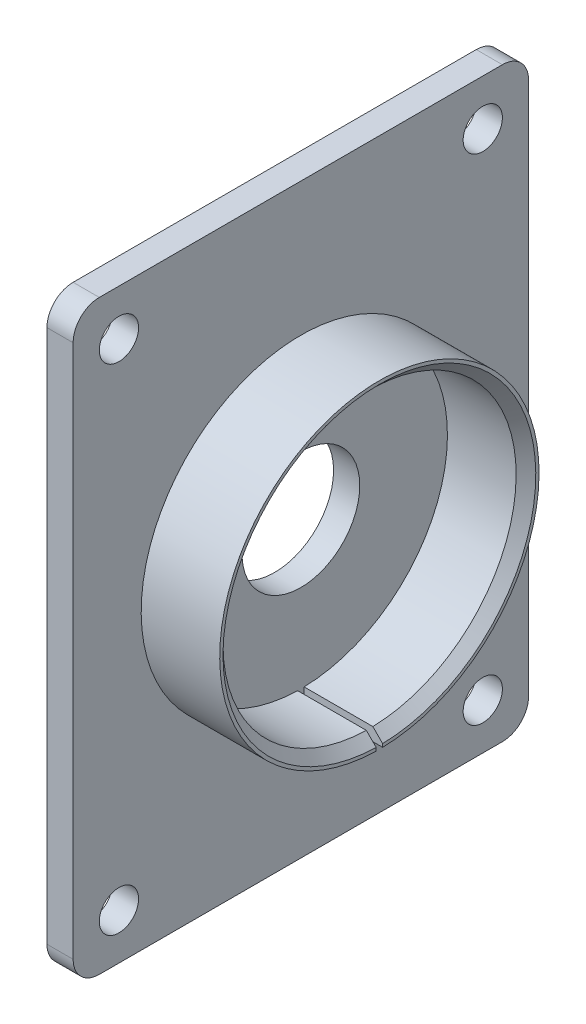
ISO-10303-21;
HEADER;
FILE_DESCRIPTION(('STEP AP214'),'2;1');
FILE_NAME('part.step','',(''),(''),'','','');
FILE_SCHEMA(('AUTOMOTIVE_DESIGN { 1 0 10303 214 1 1 1 1 }'));
ENDSEC;
DATA;
#1=APPLICATION_CONTEXT('core data for automotive mechanical design processes');
#2=APPLICATION_PROTOCOL_DEFINITION('international standard','automotive_design',2000,#1);
#3=PRODUCT_CONTEXT('',#1,'mechanical');
#4=PRODUCT('Part','Part','',(#3));
#5=PRODUCT_RELATED_PRODUCT_CATEGORY('part','',(#4));
#6=PRODUCT_DEFINITION_FORMATION('','',#4);
#7=PRODUCT_DEFINITION_CONTEXT('part definition',#1,'design');
#8=PRODUCT_DEFINITION('design','',#6,#7);
#9=PRODUCT_DEFINITION_SHAPE('','',#8);
#10=(LENGTH_UNIT() NAMED_UNIT(*) SI_UNIT(.MILLI.,.METRE.));
#11=(NAMED_UNIT(*) PLANE_ANGLE_UNIT() SI_UNIT($,.RADIAN.));
#12=(NAMED_UNIT(*) SI_UNIT($,.STERADIAN.) SOLID_ANGLE_UNIT());
#13=UNCERTAINTY_MEASURE_WITH_UNIT(LENGTH_MEASURE(1.E-05),#10,'distance_accuracy_value','');
#14=(GEOMETRIC_REPRESENTATION_CONTEXT(3) GLOBAL_UNCERTAINTY_ASSIGNED_CONTEXT((#13)) GLOBAL_UNIT_ASSIGNED_CONTEXT((#10,
#11,#12)) REPRESENTATION_CONTEXT('',''));
#15=CARTESIAN_POINT('',(0.,0.,0.));
#16=DIRECTION('',(0.,0.,1.));
#17=DIRECTION('',(1.,0.,0.));
#18=AXIS2_PLACEMENT_3D('',#15,#16,#17);
#19=CARTESIAN_POINT('',(6.,0.,0.));
#20=DIRECTION('',(-1.,0.,0.));
#21=DIRECTION('',(0.,0.,1.));
#22=AXIS2_PLACEMENT_3D('',#19,#20,#21);
#23=CYLINDRICAL_SURFACE('',#22,12.2);
#24=CARTESIAN_POINT('',(0.,0.,0.));
#25=DIRECTION('',(1.,0.,0.));
#26=DIRECTION('',(0.,0.,-1.));
#27=AXIS2_PLACEMENT_3D('',#24,#25,#26);
#28=CIRCLE('',#27,12.2);
#29=CARTESIAN_POINT('',(0.,-12.1974382556338,-0.25));
#30=VERTEX_POINT('',#29);
#31=CARTESIAN_POINT('',(0.,-12.1974382556338,0.25));
#32=VERTEX_POINT('',#31);
#33=EDGE_CURVE('E150',#30,#32,#28,.T.);
#34=ORIENTED_EDGE('',*,*,#33,.T.);
#35=DIRECTION('',(-1.,0.,0.));
#36=VECTOR('',#35,1.);
#37=CARTESIAN_POINT('',(6.,-12.1974382556338,0.25));
#38=LINE('',#37,#36);
#39=CARTESIAN_POINT('',(6.,-12.1974382556338,0.25));
#40=VERTEX_POINT('',#39);
#41=EDGE_CURVE('E155',#40,#32,#38,.T.);
#42=ORIENTED_EDGE('',*,*,#41,.F.);
#43=CARTESIAN_POINT('',(6.,0.,0.));
#44=DIRECTION('',(1.,0.,0.));
#45=DIRECTION('',(0.,0.,-1.));
#46=AXIS2_PLACEMENT_3D('',#43,#44,#45);
#47=CIRCLE('',#46,12.2);
#48=CARTESIAN_POINT('',(6.,-12.1974382556338,-0.25));
#49=VERTEX_POINT('',#48);
#50=EDGE_CURVE('E177',#49,#40,#47,.T.);
#51=ORIENTED_EDGE('',*,*,#50,.F.);
#52=DIRECTION('',(-1.,0.,0.));
#53=VECTOR('',#52,1.);
#54=CARTESIAN_POINT('',(6.,-12.1974382556338,-0.25));
#55=LINE('',#54,#53);
#56=EDGE_CURVE('E168',#49,#30,#55,.T.);
#57=ORIENTED_EDGE('',*,*,#56,.T.);
#58=EDGE_LOOP('',(#34,#42,#51,#57));
#59=FACE_BOUND('',#58,.T.);
#60=ADVANCED_FACE('F41',(#59),#23,.T.);
#61=CARTESIAN_POINT('',(6.,-12.1974382556338,0.25));
#62=DIRECTION('',(0.,0.,1.));
#63=DIRECTION('',(1.,0.,0.));
#64=AXIS2_PLACEMENT_3D('',#61,#62,#63);
#65=PLANE('',#64);
#66=DIRECTION('',(-1.,0.,0.));
#67=VECTOR('',#66,1.);
#68=CARTESIAN_POINT('',(6.,-11.197209473793,0.250000000000013));
#69=LINE('',#68,#67);
#70=CARTESIAN_POINT('',(5.24999999999999,-11.197209473793,0.250000000000013));
#71=VERTEX_POINT('',#70);
#72=CARTESIAN_POINT('',(0.,-11.197209473793,0.250000000000013));
#73=VERTEX_POINT('',#72);
#74=EDGE_CURVE('E162',#71,#73,#69,.T.);
#75=ORIENTED_EDGE('',*,*,#74,.F.);
#76=CARTESIAN_POINT('',(5.24999999999999,-11.197209473793,0.250000000000013));
#77=CARTESIAN_POINT('',(5.37499905378717,-11.3222396159935,0.250000000000006));
#78=CARTESIAN_POINT('',(5.49999858068079,-11.447269285198,0.250000000000002));
#79=CARTESIAN_POINT('',(5.7499985806808,-11.697327677615,0.249999999999998));
#80=CARTESIAN_POINT('',(5.87499905378718,-11.8223564008274,0.249999999999998));
#81=CARTESIAN_POINT('',(6.,-11.9473846510439,0.25));
#82=B_SPLINE_CURVE_WITH_KNOTS('',3,(#76,#77,#78,#79,#80,#81),.UNSPECIFIED.,.F.,.F.,(4,2,4),(0.,
0.530392024021061,1.06078404804163),.UNSPECIFIED.);
#83=CARTESIAN_POINT('',(6.,-11.9473846510439,0.25));
#84=VERTEX_POINT('',#83);
#85=EDGE_CURVE('E11',#71,#84,#82,.T.);
#86=ORIENTED_EDGE('',*,*,#85,.T.);
#87=DIRECTION('',(0.,1.,0.));
#88=VECTOR('',#87,1.);
#89=CARTESIAN_POINT('',(6.,-12.1974382556338,0.25));
#90=LINE('',#89,#88);
#91=EDGE_CURVE('E159',#40,#84,#90,.T.);
#92=ORIENTED_EDGE('',*,*,#91,.F.);
#93=ORIENTED_EDGE('',*,*,#41,.T.);
#94=DIRECTION('',(0.,1.,0.));
#95=VECTOR('',#94,1.);
#96=CARTESIAN_POINT('',(0.,-12.1974382556338,0.25));
#97=LINE('',#96,#95);
#98=EDGE_CURVE('E142',#32,#73,#97,.T.);
#99=ORIENTED_EDGE('',*,*,#98,.T.);
#100=EDGE_LOOP('',(#75,#86,#92,#93,#99));
#101=FACE_BOUND('',#100,.T.);
#102=ADVANCED_FACE('F151',(#101),#65,.F.);
#103=CARTESIAN_POINT('',(6.,0.,0.));
#104=DIRECTION('',(-1.,0.,0.));
#105=DIRECTION('',(0.,0.,1.));
#106=AXIS2_PLACEMENT_3D('',#103,#104,#105);
#107=CYLINDRICAL_SURFACE('',#106,11.2);
#108=DIRECTION('',(-1.,0.,0.));
#109=VECTOR('',#108,1.);
#110=CARTESIAN_POINT('',(6.,-11.197209473793,-0.25));
#111=LINE('',#110,#109);
#112=CARTESIAN_POINT('',(5.24999999999999,-11.197209473793,-0.25));
#113=VERTEX_POINT('',#112);
#114=CARTESIAN_POINT('',(0.,-11.197209473793,-0.25));
#115=VERTEX_POINT('',#114);
#116=EDGE_CURVE('E181',#113,#115,#111,.T.);
#117=ORIENTED_EDGE('',*,*,#116,.F.);
#118=CARTESIAN_POINT('',(5.24999999999999,0.,0.));
#119=DIRECTION('',(1.,0.,0.));
#120=DIRECTION('',(0.,0.,-1.));
#121=AXIS2_PLACEMENT_3D('',#118,#119,#120);
#122=CIRCLE('',#121,11.2);
#123=EDGE_CURVE('E57',#113,#71,#122,.T.);
#124=ORIENTED_EDGE('',*,*,#123,.T.);
#125=ORIENTED_EDGE('',*,*,#74,.T.);
#126=CARTESIAN_POINT('',(0.,0.,0.));
#127=DIRECTION('',(-1.,0.,0.));
#128=DIRECTION('',(0.,0.,-1.));
#129=AXIS2_PLACEMENT_3D('',#126,#127,#128);
#130=CIRCLE('',#129,11.2);
#131=EDGE_CURVE('E148',#73,#115,#130,.T.);
#132=ORIENTED_EDGE('',*,*,#131,.T.);
#133=EDGE_LOOP('',(#117,#124,#125,#132));
#134=FACE_BOUND('',#133,.T.);
#135=ADVANCED_FACE('F231',(#134),#107,.F.);
#136=CARTESIAN_POINT('',(6.,-12.1974382556338,-0.25));
#137=DIRECTION('',(0.,0.,-1.));
#138=DIRECTION('',(-1.,0.,0.));
#139=AXIS2_PLACEMENT_3D('',#136,#137,#138);
#140=PLANE('',#139);
#141=DIRECTION('',(0.,-1.,0.));
#142=VECTOR('',#141,1.);
#143=CARTESIAN_POINT('',(6.,-12.1974382556338,-0.25));
#144=LINE('',#143,#142);
#145=CARTESIAN_POINT('',(6.,-11.9473846510439,-0.25));
#146=VERTEX_POINT('',#145);
#147=EDGE_CURVE('E173',#146,#49,#144,.T.);
#148=ORIENTED_EDGE('',*,*,#147,.F.);
#149=CARTESIAN_POINT('',(6.,-11.9473846510439,-0.25));
#150=CARTESIAN_POINT('',(5.87499905378718,-11.8223564008274,-0.25));
#151=CARTESIAN_POINT('',(5.74999858068079,-11.697327677615,-0.25));
#152=CARTESIAN_POINT('',(5.49999858068079,-11.447269285198,-0.25));
#153=CARTESIAN_POINT('',(5.37499905378717,-11.3222396159935,-0.25));
#154=CARTESIAN_POINT('',(5.24999999999999,-11.197209473793,-0.25));
#155=B_SPLINE_CURVE_WITH_KNOTS('',3,(#149,#150,#151,#152,#153,#154),.UNSPECIFIED.,.F.,.F.,(4,2,
4),(0.,0.530392024020568,1.06078404804163),.UNSPECIFIED.);
#156=EDGE_CURVE('E66',#146,#113,#155,.T.);
#157=ORIENTED_EDGE('',*,*,#156,.T.);
#158=ORIENTED_EDGE('',*,*,#116,.T.);
#159=DIRECTION('',(0.,-1.,0.));
#160=VECTOR('',#159,1.);
#161=CARTESIAN_POINT('',(0.,-12.1974382556338,-0.25));
#162=LINE('',#161,#160);
#163=EDGE_CURVE('E180',#115,#30,#162,.T.);
#164=ORIENTED_EDGE('',*,*,#163,.T.);
#165=ORIENTED_EDGE('',*,*,#56,.F.);
#166=EDGE_LOOP('',(#148,#157,#158,#164,#165));
#167=FACE_BOUND('',#166,.T.);
#168=ADVANCED_FACE('F227',(#167),#140,.F.);
#169=CARTESIAN_POINT('',(6.,0.,0.));
#170=DIRECTION('',(1.,0.,0.));
#171=DIRECTION('',(0.,0.,-1.));
#172=AXIS2_PLACEMENT_3D('',#169,#170,#171);
#173=PLANE('',#172);
#174=ORIENTED_EDGE('',*,*,#91,.T.);
#175=CARTESIAN_POINT('',(6.,0.,0.));
#176=DIRECTION('',(1.,0.,0.));
#177=DIRECTION('',(0.,0.,-1.));
#178=AXIS2_PLACEMENT_3D('',#175,#176,#177);
#179=CIRCLE('',#178,11.95);
#180=EDGE_CURVE('E220',#84,#146,#179,.F.);
#181=ORIENTED_EDGE('',*,*,#180,.T.);
#182=ORIENTED_EDGE('',*,*,#147,.T.);
#183=ORIENTED_EDGE('',*,*,#50,.T.);
#184=EDGE_LOOP('',(#174,#181,#182,#183));
#185=FACE_BOUND('',#184,.T.);
#186=ADVANCED_FACE('F235',(#185),#173,.T.);
#187=CARTESIAN_POINT('',(-2.,0.,0.));
#188=DIRECTION('',(-1.,0.,0.));
#189=DIRECTION('',(0.,0.,1.));
#190=AXIS2_PLACEMENT_3D('',#187,#188,#189);
#191=PLANE('',#190);
#192=CARTESIAN_POINT('',(-2.,0.,0.));
#193=DIRECTION('',(1.,0.,0.));
#194=DIRECTION('',(0.,0.,-1.));
#195=AXIS2_PLACEMENT_3D('',#192,#193,#194);
#196=CIRCLE('',#195,4.5);
#197=CARTESIAN_POINT('',(-2.,0.,-4.5));
#198=VERTEX_POINT('',#197);
#199=EDGE_CURVE('E365',#198,#198,#196,.T.);
#200=ORIENTED_EDGE('',*,*,#199,.T.);
#201=EDGE_LOOP('',(#200));
#202=FACE_BOUND('',#201,.T.);
#203=CARTESIAN_POINT('',(-2.,18.9,-13.9));
#204=DIRECTION('',(-1.,0.,0.));
#205=DIRECTION('',(0.,0.,1.));
#206=AXIS2_PLACEMENT_3D('',#203,#204,#205);
#207=CIRCLE('',#206,1.5);
#208=CARTESIAN_POINT('',(-2.,18.9,-12.4));
#209=VERTEX_POINT('',#208);
#210=EDGE_CURVE('E369',#209,#209,#207,.T.);
#211=ORIENTED_EDGE('',*,*,#210,.F.);
#212=EDGE_LOOP('',(#211));
#213=FACE_BOUND('',#212,.T.);
#214=CARTESIAN_POINT('',(-2.,18.9,13.9));
#215=DIRECTION('',(-1.,0.,0.));
#216=DIRECTION('',(0.,0.,1.));
#217=AXIS2_PLACEMENT_3D('',#214,#215,#216);
#218=CIRCLE('',#217,1.5);
#219=CARTESIAN_POINT('',(-2.,18.9,15.4));
#220=VERTEX_POINT('',#219);
#221=EDGE_CURVE('E286',#220,#220,#218,.T.);
#222=ORIENTED_EDGE('',*,*,#221,.F.);
#223=EDGE_LOOP('',(#222));
#224=FACE_BOUND('',#223,.T.);
#225=DIRECTION('',(0.,0.,1.));
#226=VECTOR('',#225,1.);
#227=CARTESIAN_POINT('',(-2.,-22.4,-17.4));
#228=LINE('',#227,#226);
#229=CARTESIAN_POINT('',(-2.,-22.4,-15.4));
#230=VERTEX_POINT('',#229);
#231=CARTESIAN_POINT('',(-2.,-22.4,15.4));
#232=VERTEX_POINT('',#231);
#233=EDGE_CURVE('E170',#230,#232,#228,.T.);
#234=ORIENTED_EDGE('',*,*,#233,.T.);
#235=CARTESIAN_POINT('',(-2.,-20.4,15.4));
#236=DIRECTION('',(-1.,0.,0.));
#237=DIRECTION('',(0.,0.,1.));
#238=AXIS2_PLACEMENT_3D('',#235,#236,#237);
#239=CIRCLE('',#238,2.);
#240=CARTESIAN_POINT('',(-2.,-20.4,17.4));
#241=VERTEX_POINT('',#240);
#242=EDGE_CURVE('E210',#232,#241,#239,.T.);
#243=ORIENTED_EDGE('',*,*,#242,.T.);
#244=DIRECTION('',(0.,1.,0.));
#245=VECTOR('',#244,1.);
#246=CARTESIAN_POINT('',(-2.,22.4,17.4));
#247=LINE('',#246,#245);
#248=CARTESIAN_POINT('',(-2.,20.4,17.4));
#249=VERTEX_POINT('',#248);
#250=EDGE_CURVE('E271',#241,#249,#247,.T.);
#251=ORIENTED_EDGE('',*,*,#250,.T.);
#252=CARTESIAN_POINT('',(-2.,20.4,15.4));
#253=DIRECTION('',(-1.,0.,0.));
#254=DIRECTION('',(0.,0.,1.));
#255=AXIS2_PLACEMENT_3D('',#252,#253,#254);
#256=CIRCLE('',#255,2.);
#257=CARTESIAN_POINT('',(-2.,22.4,15.4));
#258=VERTEX_POINT('',#257);
#259=EDGE_CURVE('E203',#249,#258,#256,.T.);
#260=ORIENTED_EDGE('',*,*,#259,.T.);
#261=DIRECTION('',(0.,0.,-1.));
#262=VECTOR('',#261,1.);
#263=CARTESIAN_POINT('',(-2.,22.4,-17.4));
#264=LINE('',#263,#262);
#265=CARTESIAN_POINT('',(-2.,22.4,-15.4));
#266=VERTEX_POINT('',#265);
#267=EDGE_CURVE('E266',#258,#266,#264,.T.);
#268=ORIENTED_EDGE('',*,*,#267,.T.);
#269=CARTESIAN_POINT('',(-2.,20.4,-15.4));
#270=DIRECTION('',(-1.,0.,0.));
#271=DIRECTION('',(0.,0.,1.));
#272=AXIS2_PLACEMENT_3D('',#269,#270,#271);
#273=CIRCLE('',#272,2.);
#274=CARTESIAN_POINT('',(-2.,20.4,-17.4));
#275=VERTEX_POINT('',#274);
#276=EDGE_CURVE('E202',#266,#275,#273,.T.);
#277=ORIENTED_EDGE('',*,*,#276,.T.);
#278=DIRECTION('',(0.,-1.,0.));
#279=VECTOR('',#278,1.);
#280=CARTESIAN_POINT('',(-2.,22.4,-17.4));
#281=LINE('',#280,#279);
#282=CARTESIAN_POINT('',(-2.,-20.4,-17.4));
#283=VERTEX_POINT('',#282);
#284=EDGE_CURVE('E167',#275,#283,#281,.T.);
#285=ORIENTED_EDGE('',*,*,#284,.T.);
#286=CARTESIAN_POINT('',(-2.,-20.4,-15.4));
#287=DIRECTION('',(-1.,0.,0.));
#288=DIRECTION('',(0.,0.,1.));
#289=AXIS2_PLACEMENT_3D('',#286,#287,#288);
#290=CIRCLE('',#289,2.);
#291=EDGE_CURVE('E201',#283,#230,#290,.T.);
#292=ORIENTED_EDGE('',*,*,#291,.T.);
#293=EDGE_LOOP('',(#234,#243,#251,#260,#268,#277,#285,#292));
#294=FACE_BOUND('',#293,.T.);
#295=CARTESIAN_POINT('',(-2.,-18.9,13.9));
#296=DIRECTION('',(-1.,0.,0.));
#297=DIRECTION('',(0.,0.,1.));
#298=AXIS2_PLACEMENT_3D('',#295,#296,#297);
#299=CIRCLE('',#298,1.5);
#300=CARTESIAN_POINT('',(-2.,-18.9,15.4));
#301=VERTEX_POINT('',#300);
#302=EDGE_CURVE('E372',#301,#301,#299,.T.);
#303=ORIENTED_EDGE('',*,*,#302,.F.);
#304=EDGE_LOOP('',(#303));
#305=FACE_BOUND('',#304,.T.);
#306=CARTESIAN_POINT('',(-2.,-18.9,-13.9));
#307=DIRECTION('',(-1.,0.,0.));
#308=DIRECTION('',(0.,0.,1.));
#309=AXIS2_PLACEMENT_3D('',#306,#307,#308);
#310=CIRCLE('',#309,1.5);
#311=CARTESIAN_POINT('',(-2.,-18.9,-12.4));
#312=VERTEX_POINT('',#311);
#313=EDGE_CURVE('E363',#312,#312,#310,.T.);
#314=ORIENTED_EDGE('',*,*,#313,.F.);
#315=EDGE_LOOP('',(#314));
#316=FACE_BOUND('',#315,.T.);
#317=ADVANCED_FACE('F267',(#202,#213,#224,#294,#305,#316),#191,.T.);
#318=CARTESIAN_POINT('',(0.,0.,0.));
#319=DIRECTION('',(-1.,0.,0.));
#320=DIRECTION('',(0.,0.,1.));
#321=AXIS2_PLACEMENT_3D('',#318,#319,#320);
#322=PLANE('',#321);
#323=CARTESIAN_POINT('',(0.,0.,0.));
#324=DIRECTION('',(1.,0.,0.));
#325=DIRECTION('',(0.,0.,-1.));
#326=AXIS2_PLACEMENT_3D('',#323,#324,#325);
#327=CIRCLE('',#326,4.5);
#328=CARTESIAN_POINT('',(0.,0.,-4.5));
#329=VERTEX_POINT('',#328);
#330=EDGE_CURVE('E366',#329,#329,#327,.T.);
#331=ORIENTED_EDGE('',*,*,#330,.F.);
#332=EDGE_LOOP('',(#331));
#333=FACE_BOUND('',#332,.T.);
#334=ORIENTED_EDGE('',*,*,#33,.F.);
#335=ORIENTED_EDGE('',*,*,#163,.F.);
#336=ORIENTED_EDGE('',*,*,#131,.F.);
#337=ORIENTED_EDGE('',*,*,#98,.F.);
#338=EDGE_LOOP('',(#334,#335,#336,#337));
#339=FACE_BOUND('',#338,.T.);
#340=DIRECTION('',(0.,1.,0.));
#341=VECTOR('',#340,1.);
#342=CARTESIAN_POINT('',(0.,22.4,17.4));
#343=LINE('',#342,#341);
#344=CARTESIAN_POINT('',(0.,-20.4,17.4));
#345=VERTEX_POINT('',#344);
#346=CARTESIAN_POINT('',(0.,20.4,17.4));
#347=VERTEX_POINT('',#346);
#348=EDGE_CURVE('E288',#345,#347,#343,.T.);
#349=ORIENTED_EDGE('',*,*,#348,.F.);
#350=CARTESIAN_POINT('',(0.,-20.4,15.4));
#351=DIRECTION('',(-1.,0.,0.));
#352=DIRECTION('',(0.,0.,1.));
#353=AXIS2_PLACEMENT_3D('',#350,#351,#352);
#354=CIRCLE('',#353,2.);
#355=CARTESIAN_POINT('',(0.,-22.4,15.4));
#356=VERTEX_POINT('',#355);
#357=EDGE_CURVE('E191',#345,#356,#354,.F.);
#358=ORIENTED_EDGE('',*,*,#357,.T.);
#359=DIRECTION('',(0.,0.,1.));
#360=VECTOR('',#359,1.);
#361=CARTESIAN_POINT('',(0.,-22.4,-17.4));
#362=LINE('',#361,#360);
#363=CARTESIAN_POINT('',(0.,-22.4,-15.4));
#364=VERTEX_POINT('',#363);
#365=EDGE_CURVE('E284',#364,#356,#362,.T.);
#366=ORIENTED_EDGE('',*,*,#365,.F.);
#367=CARTESIAN_POINT('',(0.,-20.4,-15.4));
#368=DIRECTION('',(-1.,0.,0.));
#369=DIRECTION('',(0.,0.,1.));
#370=AXIS2_PLACEMENT_3D('',#367,#368,#369);
#371=CIRCLE('',#370,2.);
#372=CARTESIAN_POINT('',(0.,-20.4,-17.4));
#373=VERTEX_POINT('',#372);
#374=EDGE_CURVE('E195',#364,#373,#371,.F.);
#375=ORIENTED_EDGE('',*,*,#374,.T.);
#376=DIRECTION('',(0.,-1.,0.));
#377=VECTOR('',#376,1.);
#378=CARTESIAN_POINT('',(0.,22.4,-17.4));
#379=LINE('',#378,#377);
#380=CARTESIAN_POINT('',(0.,20.4,-17.4));
#381=VERTEX_POINT('',#380);
#382=EDGE_CURVE('E292',#381,#373,#379,.T.);
#383=ORIENTED_EDGE('',*,*,#382,.F.);
#384=CARTESIAN_POINT('',(0.,20.4,-15.4));
#385=DIRECTION('',(-1.,0.,0.));
#386=DIRECTION('',(0.,0.,1.));
#387=AXIS2_PLACEMENT_3D('',#384,#385,#386);
#388=CIRCLE('',#387,2.);
#389=CARTESIAN_POINT('',(0.,22.4,-15.4));
#390=VERTEX_POINT('',#389);
#391=EDGE_CURVE('E188',#381,#390,#388,.F.);
#392=ORIENTED_EDGE('',*,*,#391,.T.);
#393=DIRECTION('',(0.,0.,-1.));
#394=VECTOR('',#393,1.);
#395=CARTESIAN_POINT('',(0.,22.4,-17.4));
#396=LINE('',#395,#394);
#397=CARTESIAN_POINT('',(0.,22.4,15.4));
#398=VERTEX_POINT('',#397);
#399=EDGE_CURVE('E290',#398,#390,#396,.T.);
#400=ORIENTED_EDGE('',*,*,#399,.F.);
#401=CARTESIAN_POINT('',(0.,20.4,15.4));
#402=DIRECTION('',(-1.,0.,0.));
#403=DIRECTION('',(0.,0.,1.));
#404=AXIS2_PLACEMENT_3D('',#401,#402,#403);
#405=CIRCLE('',#404,2.);
#406=EDGE_CURVE('E189',#398,#347,#405,.F.);
#407=ORIENTED_EDGE('',*,*,#406,.T.);
#408=EDGE_LOOP('',(#349,#358,#366,#375,#383,#392,#400,#407));
#409=FACE_BOUND('',#408,.T.);
#410=CARTESIAN_POINT('',(0.,18.9,13.9));
#411=DIRECTION('',(-1.,0.,0.));
#412=DIRECTION('',(0.,0.,1.));
#413=AXIS2_PLACEMENT_3D('',#410,#411,#412);
#414=CIRCLE('',#413,1.5);
#415=CARTESIAN_POINT('',(0.,18.9,15.4));
#416=VERTEX_POINT('',#415);
#417=EDGE_CURVE('E347',#416,#416,#414,.T.);
#418=ORIENTED_EDGE('',*,*,#417,.T.);
#419=EDGE_LOOP('',(#418));
#420=FACE_BOUND('',#419,.T.);
#421=CARTESIAN_POINT('',(0.,-18.9,13.9));
#422=DIRECTION('',(-1.,0.,0.));
#423=DIRECTION('',(0.,0.,1.));
#424=AXIS2_PLACEMENT_3D('',#421,#422,#423);
#425=CIRCLE('',#424,1.5);
#426=CARTESIAN_POINT('',(0.,-18.9,15.4));
#427=VERTEX_POINT('',#426);
#428=EDGE_CURVE('E354',#427,#427,#425,.T.);
#429=ORIENTED_EDGE('',*,*,#428,.T.);
#430=EDGE_LOOP('',(#429));
#431=FACE_BOUND('',#430,.T.);
#432=CARTESIAN_POINT('',(0.,18.9,-13.9));
#433=DIRECTION('',(-1.,0.,0.));
#434=DIRECTION('',(0.,0.,1.));
#435=AXIS2_PLACEMENT_3D('',#432,#433,#434);
#436=CIRCLE('',#435,1.5);
#437=CARTESIAN_POINT('',(0.,18.9,-12.4));
#438=VERTEX_POINT('',#437);
#439=EDGE_CURVE('E358',#438,#438,#436,.T.);
#440=ORIENTED_EDGE('',*,*,#439,.T.);
#441=EDGE_LOOP('',(#440));
#442=FACE_BOUND('',#441,.T.);
#443=CARTESIAN_POINT('',(0.,-18.9,-13.9));
#444=DIRECTION('',(-1.,0.,0.));
#445=DIRECTION('',(0.,0.,1.));
#446=AXIS2_PLACEMENT_3D('',#443,#444,#445);
#447=CIRCLE('',#446,1.5);
#448=CARTESIAN_POINT('',(0.,-18.9,-12.4));
#449=VERTEX_POINT('',#448);
#450=EDGE_CURVE('E360',#449,#449,#447,.T.);
#451=ORIENTED_EDGE('',*,*,#450,.T.);
#452=EDGE_LOOP('',(#451));
#453=FACE_BOUND('',#452,.T.);
#454=ADVANCED_FACE('F141',(#333,#339,#409,#420,#431,#442,#453),#322,.F.);
#455=CARTESIAN_POINT('',(-2.,22.4,17.4));
#456=DIRECTION('',(0.,0.,-1.));
#457=DIRECTION('',(-1.,0.,0.));
#458=AXIS2_PLACEMENT_3D('',#455,#456,#457);
#459=PLANE('',#458);
#460=ORIENTED_EDGE('',*,*,#250,.F.);
#461=DIRECTION('',(1.,0.,0.));
#462=VECTOR('',#461,1.);
#463=CARTESIAN_POINT('',(-2.,-20.4,17.4));
#464=LINE('',#463,#462);
#465=EDGE_CURVE('E184',#241,#345,#464,.T.);
#466=ORIENTED_EDGE('',*,*,#465,.T.);
#467=ORIENTED_EDGE('',*,*,#348,.T.);
#468=DIRECTION('',(1.,0.,0.));
#469=VECTOR('',#468,1.);
#470=CARTESIAN_POINT('',(-2.,20.4,17.4));
#471=LINE('',#470,#469);
#472=EDGE_CURVE('E163',#347,#249,#471,.F.);
#473=ORIENTED_EDGE('',*,*,#472,.T.);
#474=EDGE_LOOP('',(#460,#466,#467,#473));
#475=FACE_BOUND('',#474,.T.);
#476=ADVANCED_FACE('F307',(#475),#459,.F.);
#477=CARTESIAN_POINT('',(-2.,22.4,-17.4));
#478=DIRECTION('',(0.,-1.,0.));
#479=DIRECTION('',(0.,0.,-1.));
#480=AXIS2_PLACEMENT_3D('',#477,#478,#479);
#481=PLANE('',#480);
#482=ORIENTED_EDGE('',*,*,#399,.T.);
#483=DIRECTION('',(1.,0.,0.));
#484=VECTOR('',#483,1.);
#485=CARTESIAN_POINT('',(-2.,22.4,-15.4));
#486=LINE('',#485,#484);
#487=EDGE_CURVE('E219',#390,#266,#486,.F.);
#488=ORIENTED_EDGE('',*,*,#487,.T.);
#489=ORIENTED_EDGE('',*,*,#267,.F.);
#490=DIRECTION('',(1.,0.,0.));
#491=VECTOR('',#490,1.);
#492=CARTESIAN_POINT('',(-2.,22.4,15.4));
#493=LINE('',#492,#491);
#494=EDGE_CURVE('E211',#258,#398,#493,.T.);
#495=ORIENTED_EDGE('',*,*,#494,.T.);
#496=EDGE_LOOP('',(#482,#488,#489,#495));
#497=FACE_BOUND('',#496,.T.);
#498=ADVANCED_FACE('F277',(#497),#481,.F.);
#499=CARTESIAN_POINT('',(-2.,22.4,-17.4));
#500=DIRECTION('',(0.,0.,1.));
#501=DIRECTION('',(1.,0.,0.));
#502=AXIS2_PLACEMENT_3D('',#499,#500,#501);
#503=PLANE('',#502);
#504=ORIENTED_EDGE('',*,*,#382,.T.);
#505=DIRECTION('',(1.,0.,0.));
#506=VECTOR('',#505,1.);
#507=CARTESIAN_POINT('',(-2.,-20.4,-17.4));
#508=LINE('',#507,#506);
#509=EDGE_CURVE('E215',#373,#283,#508,.F.);
#510=ORIENTED_EDGE('',*,*,#509,.T.);
#511=ORIENTED_EDGE('',*,*,#284,.F.);
#512=DIRECTION('',(1.,0.,0.));
#513=VECTOR('',#512,1.);
#514=CARTESIAN_POINT('',(-2.,20.4,-17.4));
#515=LINE('',#514,#513);
#516=EDGE_CURVE('E209',#275,#381,#515,.T.);
#517=ORIENTED_EDGE('',*,*,#516,.T.);
#518=EDGE_LOOP('',(#504,#510,#511,#517));
#519=FACE_BOUND('',#518,.T.);
#520=ADVANCED_FACE('F322',(#519),#503,.F.);
#521=CARTESIAN_POINT('',(-2.,-22.4,-17.4));
#522=DIRECTION('',(0.,1.,0.));
#523=DIRECTION('',(0.,0.,1.));
#524=AXIS2_PLACEMENT_3D('',#521,#522,#523);
#525=PLANE('',#524);
#526=ORIENTED_EDGE('',*,*,#365,.T.);
#527=DIRECTION('',(1.,0.,0.));
#528=VECTOR('',#527,1.);
#529=CARTESIAN_POINT('',(-2.,-22.4,15.4));
#530=LINE('',#529,#528);
#531=EDGE_CURVE('E200',#356,#232,#530,.F.);
#532=ORIENTED_EDGE('',*,*,#531,.T.);
#533=ORIENTED_EDGE('',*,*,#233,.F.);
#534=DIRECTION('',(1.,0.,0.));
#535=VECTOR('',#534,1.);
#536=CARTESIAN_POINT('',(-2.,-22.4,-15.4));
#537=LINE('',#536,#535);
#538=EDGE_CURVE('E198',#230,#364,#537,.T.);
#539=ORIENTED_EDGE('',*,*,#538,.T.);
#540=EDGE_LOOP('',(#526,#532,#533,#539));
#541=FACE_BOUND('',#540,.T.);
#542=ADVANCED_FACE('F319',(#541),#525,.F.);
#543=CARTESIAN_POINT('',(-2.,18.9,13.9));
#544=DIRECTION('',(1.,0.,0.));
#545=DIRECTION('',(0.,0.,-1.));
#546=AXIS2_PLACEMENT_3D('',#543,#544,#545);
#547=CYLINDRICAL_SURFACE('',#546,1.5);
#548=ORIENTED_EDGE('',*,*,#221,.T.);
#549=EDGE_LOOP('',(#548));
#550=FACE_BOUND('',#549,.T.);
#551=ORIENTED_EDGE('',*,*,#417,.F.);
#552=EDGE_LOOP('',(#551));
#553=FACE_BOUND('',#552,.T.);
#554=ADVANCED_FACE('F314',(#550,#553),#547,.F.);
#555=CARTESIAN_POINT('',(-2.,-18.9,13.9));
#556=DIRECTION('',(1.,0.,0.));
#557=DIRECTION('',(0.,0.,-1.));
#558=AXIS2_PLACEMENT_3D('',#555,#556,#557);
#559=CYLINDRICAL_SURFACE('',#558,1.5);
#560=ORIENTED_EDGE('',*,*,#302,.T.);
#561=EDGE_LOOP('',(#560));
#562=FACE_BOUND('',#561,.T.);
#563=ORIENTED_EDGE('',*,*,#428,.F.);
#564=EDGE_LOOP('',(#563));
#565=FACE_BOUND('',#564,.T.);
#566=ADVANCED_FACE('F381',(#562,#565),#559,.F.);
#567=CARTESIAN_POINT('',(-2.,18.9,-13.9));
#568=DIRECTION('',(1.,0.,0.));
#569=DIRECTION('',(0.,0.,-1.));
#570=AXIS2_PLACEMENT_3D('',#567,#568,#569);
#571=CYLINDRICAL_SURFACE('',#570,1.5);
#572=ORIENTED_EDGE('',*,*,#210,.T.);
#573=EDGE_LOOP('',(#572));
#574=FACE_BOUND('',#573,.T.);
#575=ORIENTED_EDGE('',*,*,#439,.F.);
#576=EDGE_LOOP('',(#575));
#577=FACE_BOUND('',#576,.T.);
#578=ADVANCED_FACE('F389',(#574,#577),#571,.F.);
#579=CARTESIAN_POINT('',(-2.,-18.9,-13.9));
#580=DIRECTION('',(1.,0.,0.));
#581=DIRECTION('',(0.,0.,-1.));
#582=AXIS2_PLACEMENT_3D('',#579,#580,#581);
#583=CYLINDRICAL_SURFACE('',#582,1.5);
#584=ORIENTED_EDGE('',*,*,#313,.T.);
#585=EDGE_LOOP('',(#584));
#586=FACE_BOUND('',#585,.T.);
#587=ORIENTED_EDGE('',*,*,#450,.F.);
#588=EDGE_LOOP('',(#587));
#589=FACE_BOUND('',#588,.T.);
#590=ADVANCED_FACE('F244',(#586,#589),#583,.F.);
#591=CARTESIAN_POINT('',(-2.,-20.4,15.4));
#592=DIRECTION('',(1.,0.,0.));
#593=DIRECTION('',(0.,0.,-1.));
#594=AXIS2_PLACEMENT_3D('',#591,#592,#593);
#595=CYLINDRICAL_SURFACE('',#594,2.);
#596=ORIENTED_EDGE('',*,*,#242,.F.);
#597=ORIENTED_EDGE('',*,*,#531,.F.);
#598=ORIENTED_EDGE('',*,*,#357,.F.);
#599=ORIENTED_EDGE('',*,*,#465,.F.);
#600=EDGE_LOOP('',(#596,#597,#598,#599));
#601=FACE_BOUND('',#600,.T.);
#602=ADVANCED_FACE('F241',(#601),#595,.T.);
#603=CARTESIAN_POINT('',(-2.,-20.4,-15.4));
#604=DIRECTION('',(1.,0.,0.));
#605=DIRECTION('',(0.,0.,-1.));
#606=AXIS2_PLACEMENT_3D('',#603,#604,#605);
#607=CYLINDRICAL_SURFACE('',#606,2.);
#608=ORIENTED_EDGE('',*,*,#291,.F.);
#609=ORIENTED_EDGE('',*,*,#509,.F.);
#610=ORIENTED_EDGE('',*,*,#374,.F.);
#611=ORIENTED_EDGE('',*,*,#538,.F.);
#612=EDGE_LOOP('',(#608,#609,#610,#611));
#613=FACE_BOUND('',#612,.T.);
#614=ADVANCED_FACE('F242',(#613),#607,.T.);
#615=CARTESIAN_POINT('',(-2.,20.4,-15.4));
#616=DIRECTION('',(1.,0.,0.));
#617=DIRECTION('',(0.,0.,-1.));
#618=AXIS2_PLACEMENT_3D('',#615,#616,#617);
#619=CYLINDRICAL_SURFACE('',#618,2.);
#620=ORIENTED_EDGE('',*,*,#276,.F.);
#621=ORIENTED_EDGE('',*,*,#487,.F.);
#622=ORIENTED_EDGE('',*,*,#391,.F.);
#623=ORIENTED_EDGE('',*,*,#516,.F.);
#624=EDGE_LOOP('',(#620,#621,#622,#623));
#625=FACE_BOUND('',#624,.T.);
#626=ADVANCED_FACE('F248',(#625),#619,.T.);
#627=CARTESIAN_POINT('',(-2.,20.4,15.4));
#628=DIRECTION('',(1.,0.,0.));
#629=DIRECTION('',(0.,0.,-1.));
#630=AXIS2_PLACEMENT_3D('',#627,#628,#629);
#631=CYLINDRICAL_SURFACE('',#630,2.);
#632=ORIENTED_EDGE('',*,*,#259,.F.);
#633=ORIENTED_EDGE('',*,*,#472,.F.);
#634=ORIENTED_EDGE('',*,*,#406,.F.);
#635=ORIENTED_EDGE('',*,*,#494,.F.);
#636=EDGE_LOOP('',(#632,#633,#634,#635));
#637=FACE_BOUND('',#636,.T.);
#638=ADVANCED_FACE('F255',(#637),#631,.T.);
#639=CARTESIAN_POINT('',(6.,0.,0.));
#640=DIRECTION('',(1.,0.,0.));
#641=DIRECTION('',(0.,0.,-1.));
#642=AXIS2_PLACEMENT_3D('',#639,#640,#641);
#643=CONICAL_SURFACE('',#642,11.95,0.785398163397444);
#644=ORIENTED_EDGE('',*,*,#85,.F.);
#645=ORIENTED_EDGE('',*,*,#123,.F.);
#646=ORIENTED_EDGE('',*,*,#156,.F.);
#647=ORIENTED_EDGE('',*,*,#180,.F.);
#648=EDGE_LOOP('',(#644,#645,#646,#647));
#649=FACE_BOUND('',#648,.T.);
#650=ADVANCED_FACE('F42',(#649),#643,.F.);
#651=CARTESIAN_POINT('',(-2.,0.,0.));
#652=DIRECTION('',(1.,0.,0.));
#653=DIRECTION('',(0.,0.,-1.));
#654=AXIS2_PLACEMENT_3D('',#651,#652,#653);
#655=CYLINDRICAL_SURFACE('',#654,4.5);
#656=ORIENTED_EDGE('',*,*,#199,.F.);
#657=EDGE_LOOP('',(#656));
#658=FACE_BOUND('',#657,.T.);
#659=ORIENTED_EDGE('',*,*,#330,.T.);
#660=EDGE_LOOP('',(#659));
#661=FACE_BOUND('',#660,.T.);
#662=ADVANCED_FACE('F256',(#658,#661),#655,.F.);
#663=CLOSED_SHELL('',(#60,#102,#135,#168,#186,#317,#454,#476,#498,#520,#542,#554,#566,#578,#590,
#602,#614,#626,#638,#650,#662));
#664=MANIFOLD_SOLID_BREP('B2',#663);
#665=ADVANCED_BREP_SHAPE_REPRESENTATION('',(#18,#664),#14);
#666=SHAPE_DEFINITION_REPRESENTATION(#9,#665);
ENDSEC;
END-ISO-10303-21;
